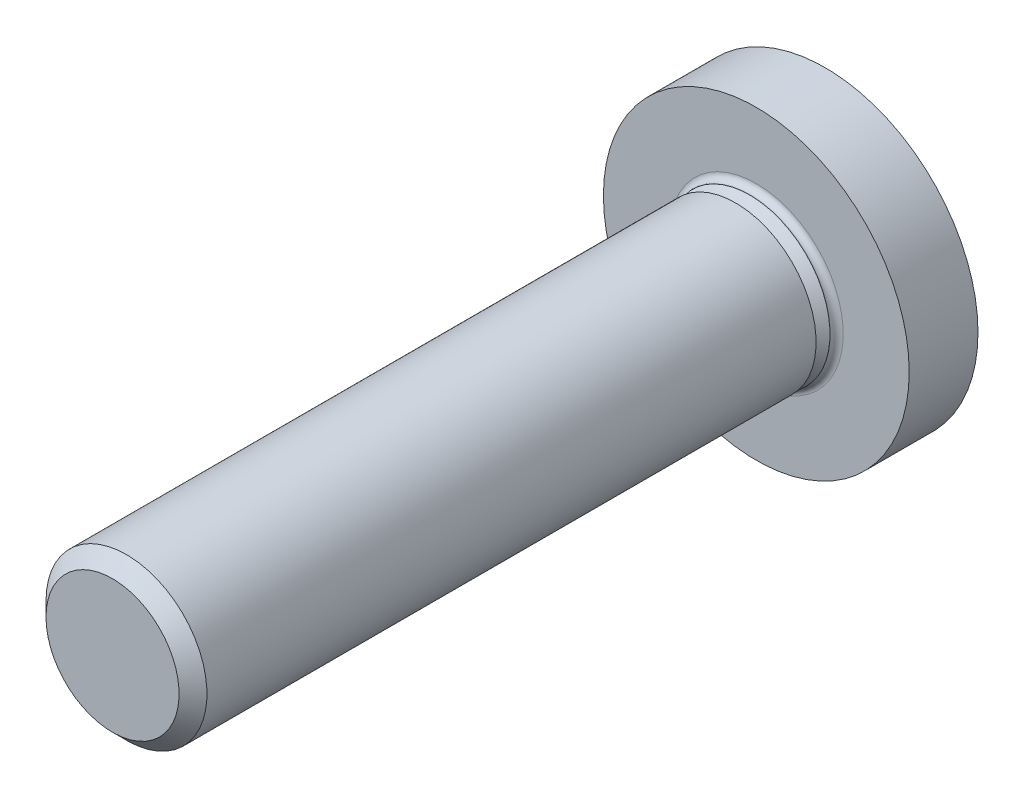
ISO-10303-21;
HEADER;
FILE_DESCRIPTION(('STEP AP214'),'2;1');
FILE_NAME('part.step','',(''),(''),'','','');
FILE_SCHEMA(('AUTOMOTIVE_DESIGN { 1 0 10303 214 1 1 1 1 }'));
ENDSEC;
DATA;
#1=APPLICATION_CONTEXT('core data for automotive mechanical design processes');
#2=APPLICATION_PROTOCOL_DEFINITION('international standard','automotive_design',2000,#1);
#3=PRODUCT_CONTEXT('',#1,'mechanical');
#4=PRODUCT('Part','Part','',(#3));
#5=PRODUCT_RELATED_PRODUCT_CATEGORY('part','',(#4));
#6=PRODUCT_DEFINITION_FORMATION('','',#4);
#7=PRODUCT_DEFINITION_CONTEXT('part definition',#1,'design');
#8=PRODUCT_DEFINITION('design','',#6,#7);
#9=PRODUCT_DEFINITION_SHAPE('','',#8);
#10=(LENGTH_UNIT() NAMED_UNIT(*) SI_UNIT(.MILLI.,.METRE.));
#11=(NAMED_UNIT(*) PLANE_ANGLE_UNIT() SI_UNIT($,.RADIAN.));
#12=(NAMED_UNIT(*) SI_UNIT($,.STERADIAN.) SOLID_ANGLE_UNIT());
#13=UNCERTAINTY_MEASURE_WITH_UNIT(LENGTH_MEASURE(1.E-05),#10,'distance_accuracy_value','');
#14=(GEOMETRIC_REPRESENTATION_CONTEXT(3) GLOBAL_UNCERTAINTY_ASSIGNED_CONTEXT((#13)) GLOBAL_UNIT_ASSIGNED_CONTEXT((#10,
#11,#12)) REPRESENTATION_CONTEXT('',''));
#15=CARTESIAN_POINT('',(0.,0.,0.));
#16=DIRECTION('',(0.,0.,1.));
#17=DIRECTION('',(1.,0.,0.));
#18=AXIS2_PLACEMENT_3D('',#15,#16,#17);
#19=CARTESIAN_POINT('',(0.,0.,8.));
#20=DIRECTION('',(0.,0.,-1.));
#21=DIRECTION('',(0.,1.,0.));
#22=AXIS2_PLACEMENT_3D('',#19,#20,#21);
#23=SPHERICAL_SURFACE('',#22,8.);
#24=CARTESIAN_POINT('',(0.,0.,1.56280340520813));
#25=DIRECTION('',(0.,0.,-1.));
#26=DIRECTION('',(-1.,0.,0.));
#27=AXIS2_PLACEMENT_3D('',#24,#25,#26);
#28=CIRCLE('',#27,4.75);
#29=CARTESIAN_POINT('',(-4.75,0.,1.56280340520814));
#30=VERTEX_POINT('',#29);
#31=EDGE_CURVE('E167',#30,#30,#28,.T.);
#32=ORIENTED_EDGE('',*,*,#31,.T.);
#33=EDGE_LOOP('',(#32));
#34=FACE_BOUND('',#33,.T.);
#35=CARTESIAN_POINT('',(-0.624137544363258,0.291040116678642,7.81547422038059));
#36=DIRECTION('',(-0.875426098065593,0.408217893676735,-0.258819045102521));
#37=DIRECTION('',(-0.422618261740699,-0.90630778703665,0.));
#38=AXIS2_PLACEMENT_3D('',#35,#36,#37);
#39=CIRCLE('',#38,7.96816780777462);
#40=CARTESIAN_POINT('',(1.03061730474433,-1.03061730474433,0.133891944403316));
#41=VERTEX_POINT('',#40);
#42=CARTESIAN_POINT('',(0.346582563727334,-2.35307070757356,0.361745044077184));
#43=VERTEX_POINT('',#42);
#44=EDGE_CURVE('E11',#41,#43,#39,.T.);
#45=ORIENTED_EDGE('',*,*,#44,.F.);
#46=CARTESIAN_POINT('',(-0.291040116678642,0.624137544363259,7.81547422038059));
#47=DIRECTION('',(-0.408217893676735,0.875426098065593,-0.258819045102521));
#48=DIRECTION('',(-0.90630778703665,-0.422618261740699,0.));
#49=AXIS2_PLACEMENT_3D('',#46,#47,#48);
#50=CIRCLE('',#49,7.96816780777462);
#51=CARTESIAN_POINT('',(2.35307070757356,-0.346582563727334,0.361745044077183));
#52=VERTEX_POINT('',#51);
#53=EDGE_CURVE('E25',#52,#41,#50,.T.);
#54=ORIENTED_EDGE('',*,*,#53,.F.);
#55=CARTESIAN_POINT('',(0.285881119635937,0.,8.07660161513776));
#56=DIRECTION('',(-0.965925826289068,0.,-0.258819045102521));
#57=DIRECTION('',(-0.258819045102521,0.,0.965925826289068));
#58=AXIS2_PLACEMENT_3D('',#55,#56,#57);
#59=CIRCLE('',#58,7.99452338654369);
#60=CARTESIAN_POINT('',(2.35307070757356,0.346582563727333,0.361745044077182));
#61=VERTEX_POINT('',#60);
#62=EDGE_CURVE('E230',#61,#52,#59,.T.);
#63=ORIENTED_EDGE('',*,*,#62,.F.);
#64=CARTESIAN_POINT('',(-0.291040116678642,-0.624137544363258,7.81547422038059));
#65=DIRECTION('',(-0.408217893676735,-0.875426098065593,-0.258819045102521));
#66=DIRECTION('',(0.90630778703665,-0.4226182617407,0.));
#67=AXIS2_PLACEMENT_3D('',#64,#65,#66);
#68=CIRCLE('',#67,7.96816780777462);
#69=CARTESIAN_POINT('',(1.03061730474433,1.03061730474433,0.133891944403315));
#70=VERTEX_POINT('',#69);
#71=EDGE_CURVE('E227',#70,#61,#68,.T.);
#72=ORIENTED_EDGE('',*,*,#71,.F.);
#73=CARTESIAN_POINT('',(-0.624137544363257,-0.291040116678642,7.81547422038059));
#74=DIRECTION('',(-0.875426098065593,-0.408217893676735,-0.258819045102521));
#75=DIRECTION('',(0.4226182617407,-0.90630778703665,0.));
#76=AXIS2_PLACEMENT_3D('',#73,#74,#75);
#77=CIRCLE('',#76,7.96816780777462);
#78=CARTESIAN_POINT('',(0.346582563727334,2.35307070757356,0.361745044077184));
#79=VERTEX_POINT('',#78);
#80=EDGE_CURVE('E224',#79,#70,#77,.T.);
#81=ORIENTED_EDGE('',*,*,#80,.F.);
#82=CARTESIAN_POINT('',(0.,0.285881119635937,8.07660161513776));
#83=DIRECTION('',(0.,-0.965925826289068,-0.258819045102521));
#84=DIRECTION('',(0.,0.258819045102521,-0.965925826289068));
#85=AXIS2_PLACEMENT_3D('',#82,#83,#84);
#86=CIRCLE('',#85,7.99452338654369);
#87=CARTESIAN_POINT('',(-0.346582563727333,2.35307070757356,0.361745044077183));
#88=VERTEX_POINT('',#87);
#89=EDGE_CURVE('E221',#88,#79,#86,.T.);
#90=ORIENTED_EDGE('',*,*,#89,.F.);
#91=CARTESIAN_POINT('',(0.624137544363259,-0.291040116678642,7.81547422038059));
#92=DIRECTION('',(0.875426098065593,-0.408217893676735,-0.258819045102521));
#93=DIRECTION('',(0.422618261740699,0.90630778703665,0.));
#94=AXIS2_PLACEMENT_3D('',#91,#92,#93);
#95=CIRCLE('',#94,7.96816780777462);
#96=CARTESIAN_POINT('',(-1.03061730474433,1.03061730474433,0.133891944403315));
#97=VERTEX_POINT('',#96);
#98=EDGE_CURVE('E218',#97,#88,#95,.T.);
#99=ORIENTED_EDGE('',*,*,#98,.F.);
#100=CARTESIAN_POINT('',(0.291040116678642,-0.624137544363258,7.81547422038059));
#101=DIRECTION('',(0.408217893676735,-0.875426098065593,-0.258819045102521));
#102=DIRECTION('',(0.90630778703665,0.422618261740699,0.));
#103=AXIS2_PLACEMENT_3D('',#100,#101,#102);
#104=CIRCLE('',#103,7.96816780777462);
#105=CARTESIAN_POINT('',(-2.35307070757356,0.346582563727334,0.361745044077184));
#106=VERTEX_POINT('',#105);
#107=EDGE_CURVE('E215',#106,#97,#104,.T.);
#108=ORIENTED_EDGE('',*,*,#107,.F.);
#109=CARTESIAN_POINT('',(-0.285881119635938,0.,8.07660161513776));
#110=DIRECTION('',(0.965925826289068,0.,-0.258819045102521));
#111=DIRECTION('',(-0.258819045102521,0.,-0.965925826289068));
#112=AXIS2_PLACEMENT_3D('',#109,#110,#111);
#113=CIRCLE('',#112,7.99452338654369);
#114=CARTESIAN_POINT('',(-2.35307070757356,-0.346582563727333,0.361745044077184));
#115=VERTEX_POINT('',#114);
#116=EDGE_CURVE('E212',#115,#106,#113,.T.);
#117=ORIENTED_EDGE('',*,*,#116,.F.);
#118=CARTESIAN_POINT('',(0.291040116678643,0.624137544363258,7.81547422038059));
#119=DIRECTION('',(0.408217893676735,0.875426098065593,-0.258819045102521));
#120=DIRECTION('',(-0.90630778703665,0.422618261740699,0.));
#121=AXIS2_PLACEMENT_3D('',#118,#119,#120);
#122=CIRCLE('',#121,7.96816780777462);
#123=CARTESIAN_POINT('',(-1.03061730474433,-1.03061730474433,0.133891944403315));
#124=VERTEX_POINT('',#123);
#125=EDGE_CURVE('E209',#124,#115,#122,.T.);
#126=ORIENTED_EDGE('',*,*,#125,.F.);
#127=CARTESIAN_POINT('',(0.624137544363258,0.291040116678642,7.81547422038059));
#128=DIRECTION('',(0.875426098065593,0.408217893676735,-0.258819045102521));
#129=DIRECTION('',(-0.422618261740699,0.90630778703665,0.));
#130=AXIS2_PLACEMENT_3D('',#127,#128,#129);
#131=CIRCLE('',#130,7.96816780777462);
#132=CARTESIAN_POINT('',(-0.346582563727334,-2.35307070757356,0.361745044077183));
#133=VERTEX_POINT('',#132);
#134=EDGE_CURVE('E206',#133,#124,#131,.T.);
#135=ORIENTED_EDGE('',*,*,#134,.F.);
#136=CARTESIAN_POINT('',(0.,-0.285881119635937,8.07660161513776));
#137=DIRECTION('',(0.,0.965925826289068,-0.258819045102521));
#138=DIRECTION('',(0.,0.258819045102521,0.965925826289068));
#139=AXIS2_PLACEMENT_3D('',#136,#137,#138);
#140=CIRCLE('',#139,7.99452338654369);
#141=EDGE_CURVE('E203',#43,#133,#140,.T.);
#142=ORIENTED_EDGE('',*,*,#141,.F.);
#143=EDGE_LOOP('',(#45,#54,#63,#72,#81,#90,#99,#108,#117,#126,#135,#142));
#144=FACE_BOUND('',#143,.T.);
#145=ADVANCED_FACE('F16',(#34,#144),#23,.T.);
#146=CARTESIAN_POINT('',(0.,0.,23.7));
#147=DIRECTION('',(0.,0.,-1.));
#148=DIRECTION('',(-1.,0.,0.));
#149=AXIS2_PLACEMENT_3D('',#146,#147,#148);
#150=PLANE('',#149);
#151=CARTESIAN_POINT('',(0.,0.,23.7));
#152=DIRECTION('',(0.,0.,-1.));
#153=DIRECTION('',(-1.,0.,0.));
#154=AXIS2_PLACEMENT_3D('',#151,#152,#153);
#155=CIRCLE('',#154,2.067);
#156=CARTESIAN_POINT('',(-2.067,0.,23.7));
#157=VERTEX_POINT('',#156);
#158=EDGE_CURVE('E199',#157,#157,#155,.T.);
#159=ORIENTED_EDGE('',*,*,#158,.F.);
#160=EDGE_LOOP('',(#159));
#161=FACE_BOUND('',#160,.T.);
#162=ADVANCED_FACE('F18',(#161),#150,.F.);
#163=CARTESIAN_POINT('',(0.,0.,23.7));
#164=DIRECTION('',(0.,0.,-1.));
#165=DIRECTION('',(-1.,0.,0.));
#166=AXIS2_PLACEMENT_3D('',#163,#164,#165);
#167=CONICAL_SURFACE('',#166,2.067,0.785398163397449);
#168=CARTESIAN_POINT('',(0.,0.,23.267));
#169=DIRECTION('',(0.,0.,-1.));
#170=DIRECTION('',(-1.,0.,0.));
#171=AXIS2_PLACEMENT_3D('',#168,#169,#170);
#172=CIRCLE('',#171,2.5);
#173=CARTESIAN_POINT('',(-2.5,0.,23.267));
#174=VERTEX_POINT('',#173);
#175=EDGE_CURVE('E195',#174,#174,#172,.T.);
#176=ORIENTED_EDGE('',*,*,#175,.F.);
#177=EDGE_LOOP('',(#176));
#178=FACE_BOUND('',#177,.T.);
#179=ORIENTED_EDGE('',*,*,#158,.T.);
#180=EDGE_LOOP('',(#179));
#181=FACE_BOUND('',#180,.T.);
#182=ADVANCED_FACE('F251',(#178,#181),#167,.T.);
#183=CARTESIAN_POINT('',(0.,0.,0.));
#184=DIRECTION('',(0.,0.,-1.));
#185=DIRECTION('',(-1.,0.,0.));
#186=AXIS2_PLACEMENT_3D('',#183,#184,#185);
#187=CYLINDRICAL_SURFACE('',#186,2.5);
#188=CARTESIAN_POINT('',(0.,0.,4.343));
#189=DIRECTION('',(0.,0.,-1.));
#190=DIRECTION('',(-1.,0.,0.));
#191=AXIS2_PLACEMENT_3D('',#188,#189,#190);
#192=CIRCLE('',#191,2.5);
#193=CARTESIAN_POINT('',(-2.5,0.,4.343));
#194=VERTEX_POINT('',#193);
#195=EDGE_CURVE('E191',#194,#194,#192,.T.);
#196=ORIENTED_EDGE('',*,*,#195,.F.);
#197=EDGE_LOOP('',(#196));
#198=FACE_BOUND('',#197,.T.);
#199=ORIENTED_EDGE('',*,*,#175,.T.);
#200=EDGE_LOOP('',(#199));
#201=FACE_BOUND('',#200,.T.);
#202=ADVANCED_FACE('F263',(#198,#201),#187,.T.);
#203=CARTESIAN_POINT('',(0.,2.5,4.343));
#204=DIRECTION('',(0.,0.,1.));
#205=DIRECTION('',(1.,0.,0.));
#206=AXIS2_PLACEMENT_3D('',#203,#204,#205);
#207=PLANE('',#206);
#208=CARTESIAN_POINT('',(0.,0.,4.343));
#209=DIRECTION('',(0.,0.,-1.));
#210=DIRECTION('',(-1.,0.,0.));
#211=AXIS2_PLACEMENT_3D('',#208,#209,#210);
#212=CIRCLE('',#211,2.067);
#213=CARTESIAN_POINT('',(-2.067,0.,4.343));
#214=VERTEX_POINT('',#213);
#215=EDGE_CURVE('E187',#214,#214,#212,.T.);
#216=ORIENTED_EDGE('',*,*,#215,.F.);
#217=EDGE_LOOP('',(#216));
#218=FACE_BOUND('',#217,.T.);
#219=ORIENTED_EDGE('',*,*,#195,.T.);
#220=EDGE_LOOP('',(#219));
#221=FACE_BOUND('',#220,.T.);
#222=ADVANCED_FACE('F273',(#218,#221),#207,.F.);
#223=CARTESIAN_POINT('',(0.,0.,4.343));
#224=DIRECTION('',(0.,0.,-1.));
#225=DIRECTION('',(-1.,0.,0.));
#226=AXIS2_PLACEMENT_3D('',#223,#224,#225);
#227=CONICAL_SURFACE('',#226,2.067,0.785398163397448);
#228=CARTESIAN_POINT('',(0.,0.,3.91));
#229=DIRECTION('',(0.,0.,-1.));
#230=DIRECTION('',(-1.,0.,0.));
#231=AXIS2_PLACEMENT_3D('',#228,#229,#230);
#232=CIRCLE('',#231,2.5);
#233=CARTESIAN_POINT('',(-2.5,0.,3.91));
#234=VERTEX_POINT('',#233);
#235=EDGE_CURVE('E183',#234,#234,#232,.T.);
#236=ORIENTED_EDGE('',*,*,#235,.F.);
#237=EDGE_LOOP('',(#236));
#238=FACE_BOUND('',#237,.T.);
#239=ORIENTED_EDGE('',*,*,#215,.T.);
#240=EDGE_LOOP('',(#239));
#241=FACE_BOUND('',#240,.T.);
#242=ADVANCED_FACE('F284',(#238,#241),#227,.T.);
#243=CARTESIAN_POINT('',(0.,0.,0.));
#244=DIRECTION('',(0.,0.,-1.));
#245=DIRECTION('',(-1.,0.,0.));
#246=AXIS2_PLACEMENT_3D('',#243,#244,#245);
#247=CYLINDRICAL_SURFACE('',#246,2.5);
#248=CARTESIAN_POINT('',(0.,0.,3.9));
#249=DIRECTION('',(0.,0.,-1.));
#250=DIRECTION('',(-1.,0.,0.));
#251=AXIS2_PLACEMENT_3D('',#248,#249,#250);
#252=CIRCLE('',#251,2.5);
#253=CARTESIAN_POINT('',(-2.5,0.,3.9));
#254=VERTEX_POINT('',#253);
#255=EDGE_CURVE('E179',#254,#254,#252,.T.);
#256=ORIENTED_EDGE('',*,*,#255,.F.);
#257=EDGE_LOOP('',(#256));
#258=FACE_BOUND('',#257,.T.);
#259=ORIENTED_EDGE('',*,*,#235,.T.);
#260=EDGE_LOOP('',(#259));
#261=FACE_BOUND('',#260,.T.);
#262=ADVANCED_FACE('F295',(#258,#261),#247,.T.);
#263=CARTESIAN_POINT('',(0.,0.,3.9));
#264=DIRECTION('',(0.,0.,-1.));
#265=DIRECTION('',(-1.,0.,0.));
#266=AXIS2_PLACEMENT_3D('',#263,#264,#265);
#267=TOROIDAL_SURFACE('',#266,2.7,0.2);
#268=ORIENTED_EDGE('',*,*,#255,.T.);
#269=EDGE_LOOP('',(#268));
#270=FACE_BOUND('',#269,.T.);
#271=CARTESIAN_POINT('',(0.,0.,3.7));
#272=DIRECTION('',(0.,0.,-1.));
#273=DIRECTION('',(-1.,0.,0.));
#274=AXIS2_PLACEMENT_3D('',#271,#272,#273);
#275=CIRCLE('',#274,2.7);
#276=CARTESIAN_POINT('',(-2.7,0.,3.7));
#277=VERTEX_POINT('',#276);
#278=EDGE_CURVE('E175',#277,#277,#275,.T.);
#279=ORIENTED_EDGE('',*,*,#278,.F.);
#280=EDGE_LOOP('',(#279));
#281=FACE_BOUND('',#280,.T.);
#282=ADVANCED_FACE('F306',(#270,#281),#267,.F.);
#283=CARTESIAN_POINT('',(0.,2.7,3.7));
#284=DIRECTION('',(0.,0.,-1.));
#285=DIRECTION('',(-1.,0.,0.));
#286=AXIS2_PLACEMENT_3D('',#283,#284,#285);
#287=PLANE('',#286);
#288=CARTESIAN_POINT('',(0.,0.,3.7));
#289=DIRECTION('',(0.,0.,-1.));
#290=DIRECTION('',(-1.,0.,0.));
#291=AXIS2_PLACEMENT_3D('',#288,#289,#290);
#292=CIRCLE('',#291,4.75);
#293=CARTESIAN_POINT('',(-4.75,0.,3.7));
#294=VERTEX_POINT('',#293);
#295=EDGE_CURVE('E171',#294,#294,#292,.T.);
#296=ORIENTED_EDGE('',*,*,#295,.F.);
#297=EDGE_LOOP('',(#296));
#298=FACE_BOUND('',#297,.T.);
#299=ORIENTED_EDGE('',*,*,#278,.T.);
#300=EDGE_LOOP('',(#299));
#301=FACE_BOUND('',#300,.T.);
#302=ADVANCED_FACE('F317',(#298,#301),#287,.F.);
#303=CARTESIAN_POINT('',(0.,0.,0.));
#304=DIRECTION('',(0.,0.,-1.));
#305=DIRECTION('',(-1.,0.,0.));
#306=AXIS2_PLACEMENT_3D('',#303,#304,#305);
#307=CYLINDRICAL_SURFACE('',#306,4.75);
#308=ORIENTED_EDGE('',*,*,#31,.F.);
#309=EDGE_LOOP('',(#308));
#310=FACE_BOUND('',#309,.T.);
#311=ORIENTED_EDGE('',*,*,#295,.T.);
#312=EDGE_LOOP('',(#311));
#313=FACE_BOUND('',#312,.T.);
#314=ADVANCED_FACE('F328',(#310,#313),#307,.T.);
#315=CARTESIAN_POINT('',(0.408333333333333,-2.45,0.));
#316=DIRECTION('',(-0.875426098065593,0.408217893676735,-0.258819045102521));
#317=DIRECTION('',(-0.422618261740699,-0.90630778703665,0.));
#318=AXIS2_PLACEMENT_3D('',#315,#316,#317);
#319=PLANE('',#318);
#320=ORIENTED_EDGE('',*,*,#44,.T.);
#321=DIRECTION('',(0.162689201767992,-0.255370893567974,-0.953057149569945));
#322=VECTOR('',#321,1.);
#323=CARTESIAN_POINT('',(0.408333333333333,-2.45,0.));
#324=LINE('',#323,#322);
#325=CARTESIAN_POINT('',(0.,-1.80904505601036,2.39207641633181));
#326=VERTEX_POINT('',#325);
#327=EDGE_CURVE('E32',#326,#43,#324,.T.);
#328=ORIENTED_EDGE('',*,*,#327,.F.);
#329=DIRECTION('',(0.,-0.535467009821226,-0.844556144606808));
#330=VECTOR('',#329,1.);
#331=CARTESIAN_POINT('',(0.,-3.07459620054544,0.396007609425984));
#332=LINE('',#331,#330);
#333=CARTESIAN_POINT('',(0.,-1.80402133120418,2.4));
#334=VERTEX_POINT('',#333);
#335=EDGE_CURVE('E111',#334,#326,#332,.T.);
#336=ORIENTED_EDGE('',*,*,#335,.F.);
#337=DIRECTION('',(0.422618261740699,0.90630778703665,0.));
#338=VECTOR('',#337,1.);
#339=CARTESIAN_POINT('',(0.0969943394144161,-1.59601629907971,2.4));
#340=LINE('',#339,#338);
#341=CARTESIAN_POINT('',(0.573705632332283,-0.573705632332282,2.4));
#342=VERTEX_POINT('',#341);
#343=EDGE_CURVE('E106',#334,#342,#340,.T.);
#344=ORIENTED_EDGE('',*,*,#343,.T.);
#345=DIRECTION('',(0.193899607686987,-0.193899607686987,-0.961668281829896));
#346=VECTOR('',#345,1.);
#347=CARTESIAN_POINT('',(1.08555231451638,-1.08555231451638,-0.138564803137273));
#348=LINE('',#347,#346);
#349=EDGE_CURVE('E109',#342,#41,#348,.T.);
#350=ORIENTED_EDGE('',*,*,#349,.T.);
#351=EDGE_LOOP('',(#320,#328,#336,#344,#350));
#352=FACE_BOUND('',#351,.T.);
#353=ADVANCED_FACE('F108',(#352),#319,.T.);
#354=CARTESIAN_POINT('',(1.05761371918659,-1.05761371918658,0.));
#355=DIRECTION('',(-0.408217893676735,0.875426098065593,-0.258819045102521));
#356=DIRECTION('',(-0.90630778703665,-0.422618261740699,0.));
#357=AXIS2_PLACEMENT_3D('',#354,#355,#356);
#358=PLANE('',#357);
#359=ORIENTED_EDGE('',*,*,#53,.T.);
#360=ORIENTED_EDGE('',*,*,#349,.F.);
#361=DIRECTION('',(0.90630778703665,0.422618261740699,0.));
#362=VECTOR('',#361,1.);
#363=CARTESIAN_POINT('',(0.165203979430989,-0.764193081449131,2.4));
#364=LINE('',#363,#362);
#365=CARTESIAN_POINT('',(1.80402133120418,0.,2.4));
#366=VERTEX_POINT('',#365);
#367=EDGE_CURVE('E116',#342,#366,#364,.T.);
#368=ORIENTED_EDGE('',*,*,#367,.T.);
#369=DIRECTION('',(0.535467009821226,0.,-0.844556144606808));
#370=VECTOR('',#369,1.);
#371=CARTESIAN_POINT('',(3.07459620054544,0.,0.396007609425983));
#372=LINE('',#371,#370);
#373=CARTESIAN_POINT('',(1.80904505601036,0.,2.39207641633181));
#374=VERTEX_POINT('',#373);
#375=EDGE_CURVE('E133',#366,#374,#372,.T.);
#376=ORIENTED_EDGE('',*,*,#375,.T.);
#377=DIRECTION('',(0.255370893567974,-0.162689201767992,-0.953057149569945));
#378=VECTOR('',#377,1.);
#379=CARTESIAN_POINT('',(2.45,-0.408333333333333,0.));
#380=LINE('',#379,#378);
#381=EDGE_CURVE('E127',#374,#52,#380,.T.);
#382=ORIENTED_EDGE('',*,*,#381,.T.);
#383=EDGE_LOOP('',(#359,#360,#368,#376,#382));
#384=FACE_BOUND('',#383,.T.);
#385=ADVANCED_FACE('F125',(#384),#358,.T.);
#386=CARTESIAN_POINT('',(2.45,-0.408333333333333,0.));
#387=DIRECTION('',(-0.965925826289068,0.,-0.258819045102521));
#388=DIRECTION('',(-0.258819045102521,0.,0.965925826289068));
#389=AXIS2_PLACEMENT_3D('',#386,#387,#388);
#390=PLANE('',#389);
#391=ORIENTED_EDGE('',*,*,#62,.T.);
#392=ORIENTED_EDGE('',*,*,#381,.F.);
#393=DIRECTION('',(0.255370893567974,0.162689201767992,-0.953057149569945));
#394=VECTOR('',#393,1.);
#395=CARTESIAN_POINT('',(2.45,0.408333333333333,0.));
#396=LINE('',#395,#394);
#397=EDGE_CURVE('E136',#374,#61,#396,.T.);
#398=ORIENTED_EDGE('',*,*,#397,.T.);
#399=EDGE_LOOP('',(#391,#392,#398));
#400=FACE_BOUND('',#399,.T.);
#401=ADVANCED_FACE('F399',(#400),#390,.T.);
#402=CARTESIAN_POINT('',(2.45,0.408333333333333,0.));
#403=DIRECTION('',(-0.408217893676735,-0.875426098065593,-0.258819045102521));
#404=DIRECTION('',(0.90630778703665,-0.4226182617407,0.));
#405=AXIS2_PLACEMENT_3D('',#402,#403,#404);
#406=PLANE('',#405);
#407=ORIENTED_EDGE('',*,*,#71,.T.);
#408=ORIENTED_EDGE('',*,*,#397,.F.);
#409=ORIENTED_EDGE('',*,*,#375,.F.);
#410=DIRECTION('',(-0.90630778703665,0.4226182617407,0.));
#411=VECTOR('',#410,1.);
#412=CARTESIAN_POINT('',(1.59601629907971,0.0969943394144154,2.4));
#413=LINE('',#412,#411);
#414=CARTESIAN_POINT('',(0.573705632332284,0.573705632332283,2.4));
#415=VERTEX_POINT('',#414);
#416=EDGE_CURVE('E122',#366,#415,#413,.T.);
#417=ORIENTED_EDGE('',*,*,#416,.T.);
#418=DIRECTION('',(0.193899607686987,0.193899607686987,-0.961668281829896));
#419=VECTOR('',#418,1.);
#420=CARTESIAN_POINT('',(1.08555231451638,1.08555231451638,-0.138564803137272));
#421=LINE('',#420,#419);
#422=EDGE_CURVE('E387',#415,#70,#421,.T.);
#423=ORIENTED_EDGE('',*,*,#422,.T.);
#424=EDGE_LOOP('',(#407,#408,#409,#417,#423));
#425=FACE_BOUND('',#424,.T.);
#426=ADVANCED_FACE('F432',(#425),#406,.T.);
#427=CARTESIAN_POINT('',(1.05761371918659,1.05761371918658,0.));
#428=DIRECTION('',(-0.875426098065593,-0.408217893676735,-0.258819045102521));
#429=DIRECTION('',(0.4226182617407,-0.90630778703665,0.));
#430=AXIS2_PLACEMENT_3D('',#427,#428,#429);
#431=PLANE('',#430);
#432=ORIENTED_EDGE('',*,*,#80,.T.);
#433=ORIENTED_EDGE('',*,*,#422,.F.);
#434=DIRECTION('',(-0.4226182617407,0.90630778703665,0.));
#435=VECTOR('',#434,1.);
#436=CARTESIAN_POINT('',(1.52780665906313,-1.4723706223573,2.4));
#437=LINE('',#436,#435);
#438=CARTESIAN_POINT('',(0.,1.80402133120418,2.4));
#439=VERTEX_POINT('',#438);
#440=EDGE_CURVE('E142',#415,#439,#437,.T.);
#441=ORIENTED_EDGE('',*,*,#440,.T.);
#442=DIRECTION('',(0.,0.535467009821226,-0.844556144606808));
#443=VECTOR('',#442,1.);
#444=CARTESIAN_POINT('',(0.,3.07459620054544,0.396007609425984));
#445=LINE('',#444,#443);
#446=CARTESIAN_POINT('',(0.,1.80904505601036,2.39207641633181));
#447=VERTEX_POINT('',#446);
#448=EDGE_CURVE('E161',#439,#447,#445,.T.);
#449=ORIENTED_EDGE('',*,*,#448,.T.);
#450=DIRECTION('',(0.162689201767992,0.255370893567974,-0.953057149569945));
#451=VECTOR('',#450,1.);
#452=CARTESIAN_POINT('',(0.408333333333334,2.45,0.));
#453=LINE('',#452,#451);
#454=EDGE_CURVE('E383',#447,#79,#453,.T.);
#455=ORIENTED_EDGE('',*,*,#454,.T.);
#456=EDGE_LOOP('',(#432,#433,#441,#449,#455));
#457=FACE_BOUND('',#456,.T.);
#458=ADVANCED_FACE('F430',(#457),#431,.T.);
#459=CARTESIAN_POINT('',(0.408333333333334,2.45,0.));
#460=DIRECTION('',(0.,-0.965925826289068,-0.258819045102521));
#461=DIRECTION('',(0.,0.258819045102521,-0.965925826289068));
#462=AXIS2_PLACEMENT_3D('',#459,#460,#461);
#463=PLANE('',#462);
#464=ORIENTED_EDGE('',*,*,#89,.T.);
#465=ORIENTED_EDGE('',*,*,#454,.F.);
#466=DIRECTION('',(-0.162689201767992,0.255370893567974,-0.953057149569945));
#467=VECTOR('',#466,1.);
#468=CARTESIAN_POINT('',(-0.408333333333333,2.45,0.));
#469=LINE('',#468,#467);
#470=EDGE_CURVE('E379',#447,#88,#469,.T.);
#471=ORIENTED_EDGE('',*,*,#470,.T.);
#472=EDGE_LOOP('',(#464,#465,#471));
#473=FACE_BOUND('',#472,.T.);
#474=ADVANCED_FACE('F428',(#473),#463,.T.);
#475=CARTESIAN_POINT('',(-0.408333333333333,2.45,0.));
#476=DIRECTION('',(0.875426098065593,-0.408217893676735,-0.258819045102521));
#477=DIRECTION('',(0.422618261740699,0.90630778703665,0.));
#478=AXIS2_PLACEMENT_3D('',#475,#476,#477);
#479=PLANE('',#478);
#480=ORIENTED_EDGE('',*,*,#98,.T.);
#481=ORIENTED_EDGE('',*,*,#470,.F.);
#482=ORIENTED_EDGE('',*,*,#448,.F.);
#483=DIRECTION('',(-0.422618261740699,-0.90630778703665,0.));
#484=VECTOR('',#483,1.);
#485=CARTESIAN_POINT('',(-1.28496617662264,-0.951597527183794,2.4));
#486=LINE('',#485,#484);
#487=CARTESIAN_POINT('',(-0.573705632332282,0.573705632332284,2.4));
#488=VERTEX_POINT('',#487);
#489=EDGE_CURVE('E146',#439,#488,#486,.T.);
#490=ORIENTED_EDGE('',*,*,#489,.T.);
#491=DIRECTION('',(-0.193899607686987,0.193899607686987,-0.961668281829896));
#492=VECTOR('',#491,1.);
#493=CARTESIAN_POINT('',(-1.08555231451638,1.08555231451638,-0.138564803137273));
#494=LINE('',#493,#492);
#495=EDGE_CURVE('E375',#488,#97,#494,.T.);
#496=ORIENTED_EDGE('',*,*,#495,.T.);
#497=EDGE_LOOP('',(#480,#481,#482,#490,#496));
#498=FACE_BOUND('',#497,.T.);
#499=ADVANCED_FACE('F422',(#498),#479,.T.);
#500=CARTESIAN_POINT('',(-1.05761371918658,1.05761371918659,0.));
#501=DIRECTION('',(0.408217893676735,-0.875426098065593,-0.258819045102521));
#502=DIRECTION('',(0.90630778703665,0.422618261740699,0.));
#503=AXIS2_PLACEMENT_3D('',#500,#501,#502);
#504=PLANE('',#503);
#505=ORIENTED_EDGE('',*,*,#107,.T.);
#506=ORIENTED_EDGE('',*,*,#495,.F.);
#507=DIRECTION('',(-0.90630778703665,-0.422618261740699,0.));
#508=VECTOR('',#507,1.);
#509=CARTESIAN_POINT('',(-0.479214792464927,0.617767434587929,2.4));
#510=LINE('',#509,#508);
#511=CARTESIAN_POINT('',(-1.80402133120418,0.,2.4));
#512=VERTEX_POINT('',#511);
#513=EDGE_CURVE('E149',#488,#512,#510,.T.);
#514=ORIENTED_EDGE('',*,*,#513,.T.);
#515=DIRECTION('',(-0.535467009821226,0.,-0.844556144606808));
#516=VECTOR('',#515,1.);
#517=CARTESIAN_POINT('',(-3.07459620054544,0.,0.396007609425984));
#518=LINE('',#517,#516);
#519=CARTESIAN_POINT('',(-1.80904505601036,0.,2.39207641633181));
#520=VERTEX_POINT('',#519);
#521=EDGE_CURVE('E164',#512,#520,#518,.T.);
#522=ORIENTED_EDGE('',*,*,#521,.T.);
#523=DIRECTION('',(-0.255370893567974,0.162689201767992,-0.953057149569945));
#524=VECTOR('',#523,1.);
#525=CARTESIAN_POINT('',(-2.45,0.408333333333333,0.));
#526=LINE('',#525,#524);
#527=EDGE_CURVE('E371',#520,#106,#526,.T.);
#528=ORIENTED_EDGE('',*,*,#527,.T.);
#529=EDGE_LOOP('',(#505,#506,#514,#522,#528));
#530=FACE_BOUND('',#529,.T.);
#531=ADVANCED_FACE('F417',(#530),#504,.T.);
#532=CARTESIAN_POINT('',(-2.45,0.408333333333333,0.));
#533=DIRECTION('',(0.965925826289068,0.,-0.258819045102521));
#534=DIRECTION('',(-0.258819045102521,0.,-0.965925826289068));
#535=AXIS2_PLACEMENT_3D('',#532,#533,#534);
#536=PLANE('',#535);
#537=ORIENTED_EDGE('',*,*,#116,.T.);
#538=ORIENTED_EDGE('',*,*,#527,.F.);
#539=DIRECTION('',(-0.255370893567974,-0.162689201767992,-0.953057149569945));
#540=VECTOR('',#539,1.);
#541=CARTESIAN_POINT('',(-2.45,-0.408333333333333,0.));
#542=LINE('',#541,#540);
#543=EDGE_CURVE('E367',#520,#115,#542,.T.);
#544=ORIENTED_EDGE('',*,*,#543,.T.);
#545=EDGE_LOOP('',(#537,#538,#544));
#546=FACE_BOUND('',#545,.T.);
#547=ADVANCED_FACE('F497',(#546),#536,.T.);
#548=CARTESIAN_POINT('',(-2.45,-0.408333333333333,0.));
#549=DIRECTION('',(0.408217893676735,0.875426098065593,-0.258819045102521));
#550=DIRECTION('',(-0.90630778703665,0.422618261740699,0.));
#551=AXIS2_PLACEMENT_3D('',#548,#549,#550);
#552=PLANE('',#551);
#553=ORIENTED_EDGE('',*,*,#125,.T.);
#554=ORIENTED_EDGE('',*,*,#543,.F.);
#555=ORIENTED_EDGE('',*,*,#521,.F.);
#556=DIRECTION('',(0.90630778703665,-0.422618261740699,0.));
#557=VECTOR('',#556,1.);
#558=CARTESIAN_POINT('',(0.951597527183793,-1.28496617662264,2.4));
#559=LINE('',#558,#557);
#560=CARTESIAN_POINT('',(-0.573705632332284,-0.573705632332282,2.4));
#561=VERTEX_POINT('',#560);
#562=EDGE_CURVE('E153',#512,#561,#559,.T.);
#563=ORIENTED_EDGE('',*,*,#562,.T.);
#564=DIRECTION('',(-0.193899607686987,-0.193899607686987,-0.961668281829896));
#565=VECTOR('',#564,1.);
#566=CARTESIAN_POINT('',(-1.08555231451638,-1.08555231451638,-0.138564803137273));
#567=LINE('',#566,#565);
#568=EDGE_CURVE('E361',#561,#124,#567,.T.);
#569=ORIENTED_EDGE('',*,*,#568,.T.);
#570=EDGE_LOOP('',(#553,#554,#555,#563,#569));
#571=FACE_BOUND('',#570,.T.);
#572=ADVANCED_FACE('F507',(#571),#552,.T.);
#573=CARTESIAN_POINT('',(-1.05761371918659,-1.05761371918658,0.));
#574=DIRECTION('',(0.875426098065593,0.408217893676735,-0.258819045102521));
#575=DIRECTION('',(-0.422618261740699,0.90630778703665,0.));
#576=AXIS2_PLACEMENT_3D('',#573,#574,#575);
#577=PLANE('',#576);
#578=ORIENTED_EDGE('',*,*,#134,.T.);
#579=ORIENTED_EDGE('',*,*,#568,.F.);
#580=DIRECTION('',(0.422618261740699,-0.90630778703665,0.));
#581=VECTOR('',#580,1.);
#582=CARTESIAN_POINT('',(0.145846143026075,-2.11678939425322,2.4));
#583=LINE('',#582,#581);
#584=EDGE_CURVE('E156',#561,#334,#583,.T.);
#585=ORIENTED_EDGE('',*,*,#584,.T.);
#586=ORIENTED_EDGE('',*,*,#335,.T.);
#587=DIRECTION('',(-0.162689201767992,-0.255370893567974,-0.953057149569945));
#588=VECTOR('',#587,1.);
#589=CARTESIAN_POINT('',(-0.408333333333333,-2.45,0.));
#590=LINE('',#589,#588);
#591=EDGE_CURVE('E355',#326,#133,#590,.T.);
#592=ORIENTED_EDGE('',*,*,#591,.T.);
#593=EDGE_LOOP('',(#578,#579,#585,#586,#592));
#594=FACE_BOUND('',#593,.T.);
#595=ADVANCED_FACE('F409',(#594),#577,.T.);
#596=CARTESIAN_POINT('',(-0.408333333333333,-2.45,0.));
#597=DIRECTION('',(0.,0.965925826289068,-0.258819045102521));
#598=DIRECTION('',(0.,0.258819045102521,0.965925826289068));
#599=AXIS2_PLACEMENT_3D('',#596,#597,#598);
#600=PLANE('',#599);
#601=ORIENTED_EDGE('',*,*,#141,.T.);
#602=ORIENTED_EDGE('',*,*,#591,.F.);
#603=ORIENTED_EDGE('',*,*,#327,.T.);
#604=EDGE_LOOP('',(#601,#602,#603));
#605=FACE_BOUND('',#604,.T.);
#606=ADVANCED_FACE('F407',(#605),#600,.T.);
#607=CARTESIAN_POINT('',(0.679820994527636,-1.86779283173586,2.4));
#608=DIRECTION('',(0.,0.,-1.));
#609=DIRECTION('',(-1.,0.,0.));
#610=AXIS2_PLACEMENT_3D('',#607,#608,#609);
#611=PLANE('',#610);
#612=ORIENTED_EDGE('',*,*,#584,.F.);
#613=ORIENTED_EDGE('',*,*,#562,.F.);
#614=ORIENTED_EDGE('',*,*,#513,.F.);
#615=ORIENTED_EDGE('',*,*,#489,.F.);
#616=ORIENTED_EDGE('',*,*,#440,.F.);
#617=ORIENTED_EDGE('',*,*,#416,.F.);
#618=ORIENTED_EDGE('',*,*,#367,.F.);
#619=ORIENTED_EDGE('',*,*,#343,.F.);
#620=EDGE_LOOP('',(#612,#613,#614,#615,#616,#617,#618,#619));
#621=FACE_BOUND('',#620,.T.);
#622=ADVANCED_FACE('F120',(#621),#611,.T.);
#623=CLOSED_SHELL('',(#145,#162,#182,#202,#222,#242,#262,#282,#302,#314,#353,#385,#401,#426,
#458,#474,#499,#531,#547,#572,#595,#606,#622));
#624=MANIFOLD_SOLID_BREP('B1',#623);
#625=ADVANCED_BREP_SHAPE_REPRESENTATION('',(#18,#624),#14);
#626=SHAPE_DEFINITION_REPRESENTATION(#9,#625);
ENDSEC;
END-ISO-10303-21;
